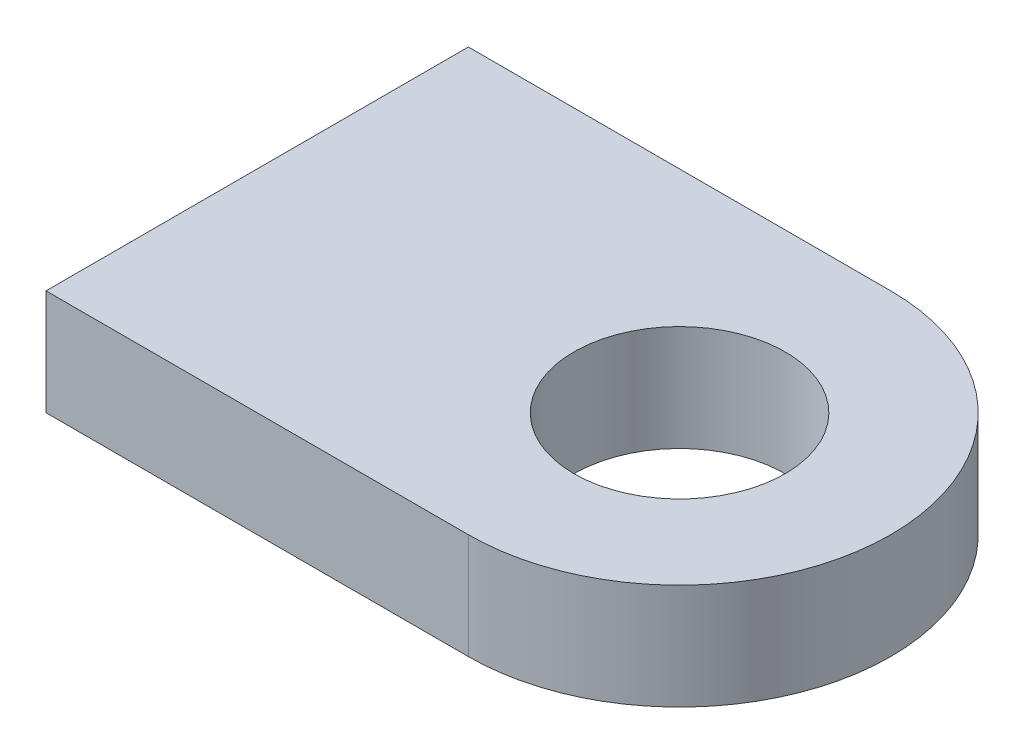
ISO-10303-21;
HEADER;
FILE_DESCRIPTION(('STEP AP214'),'2;1');
FILE_NAME('part.step','',(''),(''),'','','');
FILE_SCHEMA(('AUTOMOTIVE_DESIGN { 1 0 10303 214 1 1 1 1 }'));
ENDSEC;
DATA;
#1=APPLICATION_CONTEXT('core data for automotive mechanical design processes');
#2=APPLICATION_PROTOCOL_DEFINITION('international standard','automotive_design',2000,#1);
#3=PRODUCT_CONTEXT('',#1,'mechanical');
#4=PRODUCT('Part','Part','',(#3));
#5=PRODUCT_RELATED_PRODUCT_CATEGORY('part','',(#4));
#6=PRODUCT_DEFINITION_FORMATION('','',#4);
#7=PRODUCT_DEFINITION_CONTEXT('part definition',#1,'design');
#8=PRODUCT_DEFINITION('design','',#6,#7);
#9=PRODUCT_DEFINITION_SHAPE('','',#8);
#10=(LENGTH_UNIT() NAMED_UNIT(*) SI_UNIT(.MILLI.,.METRE.));
#11=(NAMED_UNIT(*) PLANE_ANGLE_UNIT() SI_UNIT($,.RADIAN.));
#12=(NAMED_UNIT(*) SI_UNIT($,.STERADIAN.) SOLID_ANGLE_UNIT());
#13=UNCERTAINTY_MEASURE_WITH_UNIT(LENGTH_MEASURE(1.E-05),#10,'distance_accuracy_value','');
#14=(GEOMETRIC_REPRESENTATION_CONTEXT(3) GLOBAL_UNCERTAINTY_ASSIGNED_CONTEXT((#13)) GLOBAL_UNIT_ASSIGNED_CONTEXT((#10,
#11,#12)) REPRESENTATION_CONTEXT('',''));
#15=CARTESIAN_POINT('',(0.,0.,0.));
#16=DIRECTION('',(0.,0.,1.));
#17=DIRECTION('',(1.,0.,0.));
#18=AXIS2_PLACEMENT_3D('',#15,#16,#17);
#19=CARTESIAN_POINT('',(20.,5.,0.));
#20=DIRECTION('',(0.,-1.,0.));
#21=DIRECTION('',(0.,0.,-1.));
#22=AXIS2_PLACEMENT_3D('',#19,#20,#21);
#23=PLANE('',#22);
#24=CARTESIAN_POINT('',(20.,5.,0.));
#25=DIRECTION('',(0.,1.,0.));
#26=DIRECTION('',(0.,0.,-1.));
#27=AXIS2_PLACEMENT_3D('',#24,#25,#26);
#28=CIRCLE('',#27,10.);
#29=CARTESIAN_POINT('',(20.,5.,10.));
#30=VERTEX_POINT('',#29);
#31=CARTESIAN_POINT('',(20.,5.,-10.));
#32=VERTEX_POINT('',#31);
#33=EDGE_CURVE('E92',#30,#32,#28,.T.);
#34=ORIENTED_EDGE('',*,*,#33,.T.);
#35=DIRECTION('',(-1.,0.,0.));
#36=VECTOR('',#35,1.);
#37=CARTESIAN_POINT('',(0.,5.,-10.));
#38=LINE('',#37,#36);
#39=CARTESIAN_POINT('',(0.,5.,-10.));
#40=VERTEX_POINT('',#39);
#41=EDGE_CURVE('E87',#32,#40,#38,.T.);
#42=ORIENTED_EDGE('',*,*,#41,.T.);
#43=DIRECTION('',(0.,0.,1.));
#44=VECTOR('',#43,1.);
#45=CARTESIAN_POINT('',(0.,5.,10.));
#46=LINE('',#45,#44);
#47=CARTESIAN_POINT('',(0.,5.,10.));
#48=VERTEX_POINT('',#47);
#49=EDGE_CURVE('E90',#40,#48,#46,.T.);
#50=ORIENTED_EDGE('',*,*,#49,.T.);
#51=DIRECTION('',(1.,0.,0.));
#52=VECTOR('',#51,1.);
#53=CARTESIAN_POINT('',(0.,5.,10.));
#54=LINE('',#53,#52);
#55=EDGE_CURVE('E57',#48,#30,#54,.T.);
#56=ORIENTED_EDGE('',*,*,#55,.T.);
#57=EDGE_LOOP('',(#34,#42,#50,#56));
#58=FACE_BOUND('',#57,.T.);
#59=CARTESIAN_POINT('',(20.,5.,0.));
#60=DIRECTION('',(0.,1.,0.));
#61=DIRECTION('',(0.,0.,1.));
#62=AXIS2_PLACEMENT_3D('',#59,#60,#61);
#63=CIRCLE('',#62,5.);
#64=CARTESIAN_POINT('',(20.,5.,5.));
#65=VERTEX_POINT('',#64);
#66=EDGE_CURVE('E112',#65,#65,#63,.T.);
#67=ORIENTED_EDGE('',*,*,#66,.F.);
#68=EDGE_LOOP('',(#67));
#69=FACE_BOUND('',#68,.T.);
#70=ADVANCED_FACE('F39',(#58,#69),#23,.F.);
#71=CARTESIAN_POINT('',(20.,0.,0.));
#72=DIRECTION('',(0.,-1.,0.));
#73=DIRECTION('',(0.,0.,-1.));
#74=AXIS2_PLACEMENT_3D('',#71,#72,#73);
#75=PLANE('',#74);
#76=CARTESIAN_POINT('',(20.,0.,0.));
#77=DIRECTION('',(0.,1.,0.));
#78=DIRECTION('',(0.,0.,-1.));
#79=AXIS2_PLACEMENT_3D('',#76,#77,#78);
#80=CIRCLE('',#79,10.);
#81=CARTESIAN_POINT('',(20.,0.,10.));
#82=VERTEX_POINT('',#81);
#83=CARTESIAN_POINT('',(20.,0.,-10.));
#84=VERTEX_POINT('',#83);
#85=EDGE_CURVE('E108',#82,#84,#80,.T.);
#86=ORIENTED_EDGE('',*,*,#85,.F.);
#87=DIRECTION('',(1.,0.,0.));
#88=VECTOR('',#87,1.);
#89=CARTESIAN_POINT('',(0.,0.,10.));
#90=LINE('',#89,#88);
#91=CARTESIAN_POINT('',(0.,0.,10.));
#92=VERTEX_POINT('',#91);
#93=EDGE_CURVE('E80',#92,#82,#90,.T.);
#94=ORIENTED_EDGE('',*,*,#93,.F.);
#95=DIRECTION('',(0.,0.,1.));
#96=VECTOR('',#95,1.);
#97=CARTESIAN_POINT('',(0.,0.,10.));
#98=LINE('',#97,#96);
#99=CARTESIAN_POINT('',(0.,0.,-10.));
#100=VERTEX_POINT('',#99);
#101=EDGE_CURVE('E74',#100,#92,#98,.T.);
#102=ORIENTED_EDGE('',*,*,#101,.F.);
#103=DIRECTION('',(-1.,0.,0.));
#104=VECTOR('',#103,1.);
#105=CARTESIAN_POINT('',(0.,0.,-10.));
#106=LINE('',#105,#104);
#107=EDGE_CURVE('E97',#84,#100,#106,.T.);
#108=ORIENTED_EDGE('',*,*,#107,.F.);
#109=EDGE_LOOP('',(#86,#94,#102,#108));
#110=FACE_BOUND('',#109,.T.);
#111=CARTESIAN_POINT('',(20.,0.,0.));
#112=DIRECTION('',(0.,1.,0.));
#113=DIRECTION('',(0.,0.,1.));
#114=AXIS2_PLACEMENT_3D('',#111,#112,#113);
#115=CIRCLE('',#114,5.);
#116=CARTESIAN_POINT('',(20.,0.,5.));
#117=VERTEX_POINT('',#116);
#118=EDGE_CURVE('E130',#117,#117,#115,.T.);
#119=ORIENTED_EDGE('',*,*,#118,.T.);
#120=EDGE_LOOP('',(#119));
#121=FACE_BOUND('',#120,.T.);
#122=ADVANCED_FACE('F125',(#110,#121),#75,.T.);
#123=CARTESIAN_POINT('',(20.,5.,0.));
#124=DIRECTION('',(0.,-1.,0.));
#125=DIRECTION('',(0.,0.,-1.));
#126=AXIS2_PLACEMENT_3D('',#123,#124,#125);
#127=CYLINDRICAL_SURFACE('',#126,10.);
#128=ORIENTED_EDGE('',*,*,#85,.T.);
#129=DIRECTION('',(0.,-1.,0.));
#130=VECTOR('',#129,1.);
#131=CARTESIAN_POINT('',(20.,5.,-10.));
#132=LINE('',#131,#130);
#133=EDGE_CURVE('E11',#32,#84,#132,.T.);
#134=ORIENTED_EDGE('',*,*,#133,.F.);
#135=ORIENTED_EDGE('',*,*,#33,.F.);
#136=DIRECTION('',(0.,-1.,0.));
#137=VECTOR('',#136,1.);
#138=CARTESIAN_POINT('',(20.,5.,10.));
#139=LINE('',#138,#137);
#140=EDGE_CURVE('E104',#30,#82,#139,.T.);
#141=ORIENTED_EDGE('',*,*,#140,.T.);
#142=EDGE_LOOP('',(#128,#134,#135,#141));
#143=FACE_BOUND('',#142,.T.);
#144=ADVANCED_FACE('F41',(#143),#127,.T.);
#145=CARTESIAN_POINT('',(0.,5.,-10.));
#146=DIRECTION('',(0.,0.,1.));
#147=DIRECTION('',(1.,0.,0.));
#148=AXIS2_PLACEMENT_3D('',#145,#146,#147);
#149=PLANE('',#148);
#150=ORIENTED_EDGE('',*,*,#107,.T.);
#151=DIRECTION('',(0.,-1.,0.));
#152=VECTOR('',#151,1.);
#153=CARTESIAN_POINT('',(0.,5.,-10.));
#154=LINE('',#153,#152);
#155=EDGE_CURVE('E49',#40,#100,#154,.T.);
#156=ORIENTED_EDGE('',*,*,#155,.F.);
#157=ORIENTED_EDGE('',*,*,#41,.F.);
#158=ORIENTED_EDGE('',*,*,#133,.T.);
#159=EDGE_LOOP('',(#150,#156,#157,#158));
#160=FACE_BOUND('',#159,.T.);
#161=ADVANCED_FACE('F96',(#160),#149,.F.);
#162=CARTESIAN_POINT('',(0.,5.,10.));
#163=DIRECTION('',(1.,0.,0.));
#164=DIRECTION('',(0.,0.,-1.));
#165=AXIS2_PLACEMENT_3D('',#162,#163,#164);
#166=PLANE('',#165);
#167=ORIENTED_EDGE('',*,*,#101,.T.);
#168=DIRECTION('',(0.,-1.,0.));
#169=VECTOR('',#168,1.);
#170=CARTESIAN_POINT('',(0.,5.,10.));
#171=LINE('',#170,#169);
#172=EDGE_CURVE('E99',#48,#92,#171,.T.);
#173=ORIENTED_EDGE('',*,*,#172,.F.);
#174=ORIENTED_EDGE('',*,*,#49,.F.);
#175=ORIENTED_EDGE('',*,*,#155,.T.);
#176=EDGE_LOOP('',(#167,#173,#174,#175));
#177=FACE_BOUND('',#176,.T.);
#178=ADVANCED_FACE('F100',(#177),#166,.F.);
#179=CARTESIAN_POINT('',(0.,5.,10.));
#180=DIRECTION('',(0.,0.,-1.));
#181=DIRECTION('',(-1.,0.,0.));
#182=AXIS2_PLACEMENT_3D('',#179,#180,#181);
#183=PLANE('',#182);
#184=ORIENTED_EDGE('',*,*,#93,.T.);
#185=ORIENTED_EDGE('',*,*,#140,.F.);
#186=ORIENTED_EDGE('',*,*,#55,.F.);
#187=ORIENTED_EDGE('',*,*,#172,.T.);
#188=EDGE_LOOP('',(#184,#185,#186,#187));
#189=FACE_BOUND('',#188,.T.);
#190=ADVANCED_FACE('F122',(#189),#183,.F.);
#191=CARTESIAN_POINT('',(20.,5.,0.));
#192=DIRECTION('',(0.,-1.,0.));
#193=DIRECTION('',(0.,0.,-1.));
#194=AXIS2_PLACEMENT_3D('',#191,#192,#193);
#195=CYLINDRICAL_SURFACE('',#194,5.);
#196=ORIENTED_EDGE('',*,*,#66,.T.);
#197=EDGE_LOOP('',(#196));
#198=FACE_BOUND('',#197,.T.);
#199=ORIENTED_EDGE('',*,*,#118,.F.);
#200=EDGE_LOOP('',(#199));
#201=FACE_BOUND('',#200,.T.);
#202=ADVANCED_FACE('F138',(#198,#201),#195,.F.);
#203=CLOSED_SHELL('',(#70,#122,#144,#161,#178,#190,#202));
#204=MANIFOLD_SOLID_BREP('B2',#203);
#205=ADVANCED_BREP_SHAPE_REPRESENTATION('',(#18,#204),#14);
#206=SHAPE_DEFINITION_REPRESENTATION(#9,#205);
ENDSEC;
END-ISO-10303-21;
